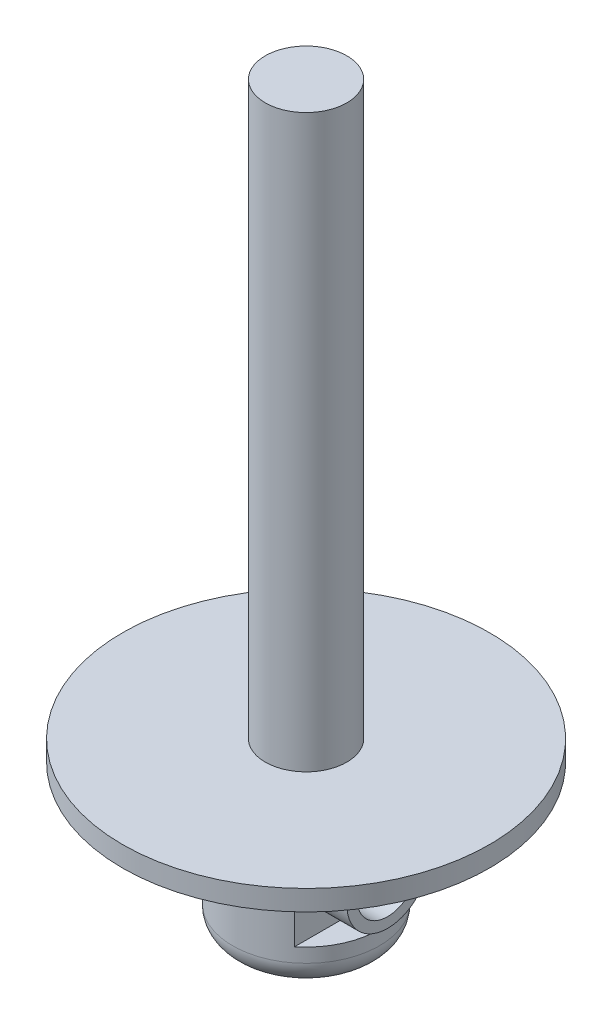
ISO-10303-21;
HEADER;
FILE_DESCRIPTION(('STEP AP214'),'2;1');
FILE_NAME('part.step','',(''),(''),'','','');
FILE_SCHEMA(('AUTOMOTIVE_DESIGN { 1 0 10303 214 1 1 1 1 }'));
ENDSEC;
DATA;
#1=APPLICATION_CONTEXT('core data for automotive mechanical design processes');
#2=APPLICATION_PROTOCOL_DEFINITION('international standard','automotive_design',2000,#1);
#3=PRODUCT_CONTEXT('',#1,'mechanical');
#4=PRODUCT('Part','Part','',(#3));
#5=PRODUCT_RELATED_PRODUCT_CATEGORY('part','',(#4));
#6=PRODUCT_DEFINITION_FORMATION('','',#4);
#7=PRODUCT_DEFINITION_CONTEXT('part definition',#1,'design');
#8=PRODUCT_DEFINITION('design','',#6,#7);
#9=PRODUCT_DEFINITION_SHAPE('','',#8);
#10=(LENGTH_UNIT() NAMED_UNIT(*) SI_UNIT(.MILLI.,.METRE.));
#11=(NAMED_UNIT(*) PLANE_ANGLE_UNIT() SI_UNIT($,.RADIAN.));
#12=(NAMED_UNIT(*) SI_UNIT($,.STERADIAN.) SOLID_ANGLE_UNIT());
#13=UNCERTAINTY_MEASURE_WITH_UNIT(LENGTH_MEASURE(1.E-05),#10,'distance_accuracy_value','');
#14=(GEOMETRIC_REPRESENTATION_CONTEXT(3) GLOBAL_UNCERTAINTY_ASSIGNED_CONTEXT((#13)) GLOBAL_UNIT_ASSIGNED_CONTEXT((#10,
#11,#12)) REPRESENTATION_CONTEXT('',''));
#15=CARTESIAN_POINT('',(0.,0.,0.));
#16=DIRECTION('',(0.,0.,1.));
#17=DIRECTION('',(1.,0.,0.));
#18=AXIS2_PLACEMENT_3D('',#15,#16,#17);
#19=CARTESIAN_POINT('',(11.25,-4.04640826936139,-45.));
#20=DIRECTION('',(-1.,0.,0.));
#21=DIRECTION('',(0.,-1.,0.));
#22=AXIS2_PLACEMENT_3D('',#19,#20,#21);
#23=PLANE('',#22);
#24=DIRECTION('',(0.,0.,1.));
#25=VECTOR('',#24,1.);
#26=CARTESIAN_POINT('',(11.25,-26.5464082693614,-45.));
#27=LINE('',#26,#25);
#28=CARTESIAN_POINT('',(11.25,-26.5464082693614,-14.0512454963964));
#29=VERTEX_POINT('',#28);
#30=CARTESIAN_POINT('',(11.25,-26.5464082693614,14.0512454963964));
#31=VERTEX_POINT('',#30);
#32=EDGE_CURVE('E101',#29,#31,#27,.T.);
#33=ORIENTED_EDGE('',*,*,#32,.F.);
#34=DIRECTION('',(0.,1.,0.));
#35=VECTOR('',#34,1.);
#36=CARTESIAN_POINT('',(11.25,-36.,-14.0512454963964));
#37=LINE('',#36,#35);
#38=CARTESIAN_POINT('',(11.25,-4.0464082693614,-14.0512454963964));
#39=VERTEX_POINT('',#38);
#40=EDGE_CURVE('E92',#39,#29,#37,.F.);
#41=ORIENTED_EDGE('',*,*,#40,.F.);
#42=DIRECTION('',(0.,0.,1.));
#43=VECTOR('',#42,1.);
#44=CARTESIAN_POINT('',(11.25,-4.04640826936139,-45.));
#45=LINE('',#44,#43);
#46=CARTESIAN_POINT('',(11.25,-4.0464082693614,14.0512454963964));
#47=VERTEX_POINT('',#46);
#48=EDGE_CURVE('E68',#39,#47,#45,.T.);
#49=ORIENTED_EDGE('',*,*,#48,.T.);
#50=DIRECTION('',(0.,1.,0.));
#51=VECTOR('',#50,1.);
#52=CARTESIAN_POINT('',(11.25,-36.,14.0512454963964));
#53=LINE('',#52,#51);
#54=EDGE_CURVE('E98',#31,#47,#53,.T.);
#55=ORIENTED_EDGE('',*,*,#54,.F.);
#56=EDGE_LOOP('',(#33,#41,#49,#55));
#57=FACE_BOUND('',#56,.T.);
#58=CARTESIAN_POINT('',(11.25,-15.2964082693614,0.));
#59=DIRECTION('',(-1.,0.,0.));
#60=DIRECTION('',(0.,-1.,0.));
#61=AXIS2_PLACEMENT_3D('',#58,#59,#60);
#62=CIRCLE('',#61,10.);
#63=CARTESIAN_POINT('',(11.25,-25.2964082693614,0.));
#64=VERTEX_POINT('',#63);
#65=EDGE_CURVE('E11',#64,#64,#62,.F.);
#66=ORIENTED_EDGE('',*,*,#65,.F.);
#67=EDGE_LOOP('',(#66));
#68=FACE_BOUND('',#67,.T.);
#69=ADVANCED_FACE('F45',(#57,#68),#23,.F.);
#70=CARTESIAN_POINT('',(-11.25,-4.0464082693614,-45.));
#71=DIRECTION('',(1.,0.,0.));
#72=DIRECTION('',(0.,1.,0.));
#73=AXIS2_PLACEMENT_3D('',#70,#71,#72);
#74=PLANE('',#73);
#75=DIRECTION('',(0.,0.,1.));
#76=VECTOR('',#75,1.);
#77=CARTESIAN_POINT('',(-11.25,-26.5464082693614,-45.));
#78=LINE('',#77,#76);
#79=CARTESIAN_POINT('',(-11.25,-26.5464082693614,-14.0512454963964));
#80=VERTEX_POINT('',#79);
#81=CARTESIAN_POINT('',(-11.25,-26.5464082693614,14.0512454963964));
#82=VERTEX_POINT('',#81);
#83=EDGE_CURVE('E61',#80,#82,#78,.T.);
#84=ORIENTED_EDGE('',*,*,#83,.T.);
#85=DIRECTION('',(0.,1.,0.));
#86=VECTOR('',#85,1.);
#87=CARTESIAN_POINT('',(-11.25,-36.,14.0512454963964));
#88=LINE('',#87,#86);
#89=CARTESIAN_POINT('',(-11.25,-4.0464082693614,14.0512454963964));
#90=VERTEX_POINT('',#89);
#91=EDGE_CURVE('E118',#90,#82,#88,.F.);
#92=ORIENTED_EDGE('',*,*,#91,.F.);
#93=DIRECTION('',(0.,0.,1.));
#94=VECTOR('',#93,1.);
#95=CARTESIAN_POINT('',(-11.25,-4.0464082693614,-45.));
#96=LINE('',#95,#94);
#97=CARTESIAN_POINT('',(-11.25,-4.0464082693614,-14.0512454963964));
#98=VERTEX_POINT('',#97);
#99=EDGE_CURVE('E204',#98,#90,#96,.T.);
#100=ORIENTED_EDGE('',*,*,#99,.F.);
#101=DIRECTION('',(0.,1.,0.));
#102=VECTOR('',#101,1.);
#103=CARTESIAN_POINT('',(-11.25,-36.,-14.0512454963964));
#104=LINE('',#103,#102);
#105=EDGE_CURVE('E122',#80,#98,#104,.T.);
#106=ORIENTED_EDGE('',*,*,#105,.F.);
#107=EDGE_LOOP('',(#84,#92,#100,#106));
#108=FACE_BOUND('',#107,.T.);
#109=CARTESIAN_POINT('',(-11.25,-15.2964082693614,0.));
#110=DIRECTION('',(1.,0.,0.));
#111=DIRECTION('',(0.,1.,0.));
#112=AXIS2_PLACEMENT_3D('',#109,#110,#111);
#113=CIRCLE('',#112,10.);
#114=CARTESIAN_POINT('',(-11.25,-5.29640826936139,0.));
#115=VERTEX_POINT('',#114);
#116=EDGE_CURVE('E49',#115,#115,#113,.F.);
#117=ORIENTED_EDGE('',*,*,#116,.F.);
#118=EDGE_LOOP('',(#117));
#119=FACE_BOUND('',#118,.T.);
#120=ADVANCED_FACE('F135',(#108,#119),#74,.F.);
#121=CARTESIAN_POINT('',(0.,5.,0.));
#122=DIRECTION('',(0.,-1.,0.));
#123=DIRECTION('',(0.,0.,-1.));
#124=AXIS2_PLACEMENT_3D('',#121,#122,#123);
#125=CYLINDRICAL_SURFACE('',#124,45.);
#126=CARTESIAN_POINT('',(0.,5.,0.));
#127=DIRECTION('',(0.,1.,0.));
#128=DIRECTION('',(0.,0.,1.));
#129=AXIS2_PLACEMENT_3D('',#126,#127,#128);
#130=CIRCLE('',#129,45.);
#131=CARTESIAN_POINT('',(0.,5.,45.));
#132=VERTEX_POINT('',#131);
#133=EDGE_CURVE('E195',#132,#132,#130,.T.);
#134=ORIENTED_EDGE('',*,*,#133,.F.);
#135=EDGE_LOOP('',(#134));
#136=FACE_BOUND('',#135,.T.);
#137=CARTESIAN_POINT('',(0.,0.,0.));
#138=DIRECTION('',(0.,1.,0.));
#139=DIRECTION('',(0.,0.,1.));
#140=AXIS2_PLACEMENT_3D('',#137,#138,#139);
#141=CIRCLE('',#140,45.);
#142=CARTESIAN_POINT('',(0.,0.,45.));
#143=VERTEX_POINT('',#142);
#144=EDGE_CURVE('E192',#143,#143,#141,.T.);
#145=ORIENTED_EDGE('',*,*,#144,.T.);
#146=EDGE_LOOP('',(#145));
#147=FACE_BOUND('',#146,.T.);
#148=ADVANCED_FACE('F137',(#136,#147),#125,.T.);
#149=CARTESIAN_POINT('',(0.,5.,0.));
#150=DIRECTION('',(0.,1.,0.));
#151=DIRECTION('',(0.,0.,1.));
#152=AXIS2_PLACEMENT_3D('',#149,#150,#151);
#153=PLANE('',#152);
#154=CARTESIAN_POINT('',(0.,5.,0.));
#155=DIRECTION('',(0.,1.,0.));
#156=DIRECTION('',(0.,0.,1.));
#157=AXIS2_PLACEMENT_3D('',#154,#155,#156);
#158=CIRCLE('',#157,10.);
#159=CARTESIAN_POINT('',(0.,5.,10.));
#160=VERTEX_POINT('',#159);
#161=EDGE_CURVE('E201',#160,#160,#158,.T.);
#162=ORIENTED_EDGE('',*,*,#161,.F.);
#163=EDGE_LOOP('',(#162));
#164=FACE_BOUND('',#163,.T.);
#165=ORIENTED_EDGE('',*,*,#133,.T.);
#166=EDGE_LOOP('',(#165));
#167=FACE_BOUND('',#166,.T.);
#168=ADVANCED_FACE('F144',(#164,#167),#153,.T.);
#169=CARTESIAN_POINT('',(0.,0.,0.));
#170=DIRECTION('',(0.,1.,0.));
#171=DIRECTION('',(0.,0.,1.));
#172=AXIS2_PLACEMENT_3D('',#169,#170,#171);
#173=PLANE('',#172);
#174=CARTESIAN_POINT('',(0.,0.,0.));
#175=DIRECTION('',(0.,-1.,0.));
#176=DIRECTION('',(0.,0.,-1.));
#177=AXIS2_PLACEMENT_3D('',#174,#175,#176);
#178=CIRCLE('',#177,18.);
#179=CARTESIAN_POINT('',(0.,0.,-18.));
#180=VERTEX_POINT('',#179);
#181=EDGE_CURVE('E189',#180,#180,#178,.T.);
#182=ORIENTED_EDGE('',*,*,#181,.F.);
#183=EDGE_LOOP('',(#182));
#184=FACE_BOUND('',#183,.T.);
#185=ORIENTED_EDGE('',*,*,#144,.F.);
#186=EDGE_LOOP('',(#185));
#187=FACE_BOUND('',#186,.T.);
#188=ADVANCED_FACE('F177',(#184,#187),#173,.F.);
#189=CARTESIAN_POINT('',(0.,145.,0.));
#190=DIRECTION('',(0.,-1.,0.));
#191=DIRECTION('',(0.,0.,-1.));
#192=AXIS2_PLACEMENT_3D('',#189,#190,#191);
#193=CYLINDRICAL_SURFACE('',#192,10.);
#194=CARTESIAN_POINT('',(0.,145.,0.));
#195=DIRECTION('',(0.,1.,0.));
#196=DIRECTION('',(0.,0.,1.));
#197=AXIS2_PLACEMENT_3D('',#194,#195,#196);
#198=CIRCLE('',#197,10.);
#199=CARTESIAN_POINT('',(0.,145.,10.));
#200=VERTEX_POINT('',#199);
#201=EDGE_CURVE('E196',#200,#200,#198,.T.);
#202=ORIENTED_EDGE('',*,*,#201,.F.);
#203=EDGE_LOOP('',(#202));
#204=FACE_BOUND('',#203,.T.);
#205=ORIENTED_EDGE('',*,*,#161,.T.);
#206=EDGE_LOOP('',(#205));
#207=FACE_BOUND('',#206,.T.);
#208=ADVANCED_FACE('F173',(#204,#207),#193,.T.);
#209=CARTESIAN_POINT('',(0.,145.,0.));
#210=DIRECTION('',(0.,1.,0.));
#211=DIRECTION('',(0.,0.,1.));
#212=AXIS2_PLACEMENT_3D('',#209,#210,#211);
#213=PLANE('',#212);
#214=ORIENTED_EDGE('',*,*,#201,.T.);
#215=EDGE_LOOP('',(#214));
#216=FACE_BOUND('',#215,.T.);
#217=ADVANCED_FACE('F170',(#216),#213,.T.);
#218=CARTESIAN_POINT('',(0.,-36.,0.));
#219=DIRECTION('',(0.,1.,0.));
#220=DIRECTION('',(0.,0.,1.));
#221=AXIS2_PLACEMENT_3D('',#218,#219,#220);
#222=CYLINDRICAL_SURFACE('',#221,18.);
#223=ORIENTED_EDGE('',*,*,#105,.T.);
#224=CARTESIAN_POINT('',(0.,-4.0464082693614,0.));
#225=DIRECTION('',(0.,1.,0.));
#226=DIRECTION('',(-1.,0.,0.));
#227=AXIS2_PLACEMENT_3D('',#224,#225,#226);
#228=CIRCLE('',#227,18.);
#229=EDGE_CURVE('E125',#98,#90,#228,.T.);
#230=ORIENTED_EDGE('',*,*,#229,.T.);
#231=ORIENTED_EDGE('',*,*,#91,.T.);
#232=CARTESIAN_POINT('',(0.,-26.5464082693614,0.));
#233=DIRECTION('',(0.,-1.,0.));
#234=DIRECTION('',(1.,0.,0.));
#235=AXIS2_PLACEMENT_3D('',#232,#233,#234);
#236=CIRCLE('',#235,18.);
#237=EDGE_CURVE('E111',#82,#80,#236,.T.);
#238=ORIENTED_EDGE('',*,*,#237,.T.);
#239=EDGE_LOOP('',(#223,#230,#231,#238));
#240=FACE_BOUND('',#239,.T.);
#241=ORIENTED_EDGE('',*,*,#40,.T.);
#242=CARTESIAN_POINT('',(0.,-26.5464082693614,0.));
#243=DIRECTION('',(0.,-1.,0.));
#244=DIRECTION('',(0.,0.,-1.));
#245=AXIS2_PLACEMENT_3D('',#242,#243,#244);
#246=CIRCLE('',#245,18.);
#247=EDGE_CURVE('E106',#29,#31,#246,.T.);
#248=ORIENTED_EDGE('',*,*,#247,.T.);
#249=ORIENTED_EDGE('',*,*,#54,.T.);
#250=CARTESIAN_POINT('',(0.,-4.0464082693614,0.));
#251=DIRECTION('',(0.,1.,0.));
#252=DIRECTION('',(-1.,0.,0.));
#253=AXIS2_PLACEMENT_3D('',#250,#251,#252);
#254=CIRCLE('',#253,18.);
#255=EDGE_CURVE('E86',#47,#39,#254,.T.);
#256=ORIENTED_EDGE('',*,*,#255,.T.);
#257=EDGE_LOOP('',(#241,#248,#249,#256));
#258=FACE_BOUND('',#257,.T.);
#259=CARTESIAN_POINT('',(0.,-30.,0.));
#260=DIRECTION('',(0.,-1.,0.));
#261=DIRECTION('',(0.,0.,-1.));
#262=AXIS2_PLACEMENT_3D('',#259,#260,#261);
#263=CIRCLE('',#262,18.);
#264=CARTESIAN_POINT('',(0.,-30.,-18.));
#265=VERTEX_POINT('',#264);
#266=EDGE_CURVE('E93',#265,#265,#263,.F.);
#267=ORIENTED_EDGE('',*,*,#266,.T.);
#268=EDGE_LOOP('',(#267));
#269=FACE_BOUND('',#268,.T.);
#270=ORIENTED_EDGE('',*,*,#181,.T.);
#271=EDGE_LOOP('',(#270));
#272=FACE_BOUND('',#271,.T.);
#273=ADVANCED_FACE('F104',(#240,#258,#269,#272),#222,.T.);
#274=CARTESIAN_POINT('',(0.,-36.,0.));
#275=DIRECTION('',(0.,-1.,0.));
#276=DIRECTION('',(0.,0.,-1.));
#277=AXIS2_PLACEMENT_3D('',#274,#275,#276);
#278=PLANE('',#277);
#279=CARTESIAN_POINT('',(0.,-36.,0.));
#280=DIRECTION('',(0.,-1.,0.));
#281=DIRECTION('',(0.,0.,-1.));
#282=AXIS2_PLACEMENT_3D('',#279,#280,#281);
#283=CIRCLE('',#282,12.);
#284=CARTESIAN_POINT('',(0.,-36.,-12.));
#285=VERTEX_POINT('',#284);
#286=EDGE_CURVE('E208',#285,#285,#283,.T.);
#287=ORIENTED_EDGE('',*,*,#286,.T.);
#288=EDGE_LOOP('',(#287));
#289=FACE_BOUND('',#288,.T.);
#290=ADVANCED_FACE('F164',(#289),#278,.T.);
#291=CARTESIAN_POINT('',(0.,-30.,0.));
#292=DIRECTION('',(0.,-1.,0.));
#293=DIRECTION('',(0.,0.,-1.));
#294=AXIS2_PLACEMENT_3D('',#291,#292,#293);
#295=TOROIDAL_SURFACE('',#294,12.,6.);
#296=ORIENTED_EDGE('',*,*,#266,.F.);
#297=EDGE_LOOP('',(#296));
#298=FACE_BOUND('',#297,.T.);
#299=ORIENTED_EDGE('',*,*,#286,.F.);
#300=EDGE_LOOP('',(#299));
#301=FACE_BOUND('',#300,.T.);
#302=ADVANCED_FACE('F47',(#298,#301),#295,.T.);
#303=CARTESIAN_POINT('',(11.25,-26.5464082693614,-45.));
#304=DIRECTION('',(0.,-1.,0.));
#305=DIRECTION('',(0.,0.,-1.));
#306=AXIS2_PLACEMENT_3D('',#303,#304,#305);
#307=PLANE('',#306);
#308=ORIENTED_EDGE('',*,*,#32,.T.);
#309=ORIENTED_EDGE('',*,*,#247,.F.);
#310=EDGE_LOOP('',(#308,#309));
#311=FACE_BOUND('',#310,.T.);
#312=ADVANCED_FACE('F159',(#311),#307,.F.);
#313=CARTESIAN_POINT('',(32.8988143773995,-4.04640826936139,-45.));
#314=DIRECTION('',(0.,1.,0.));
#315=DIRECTION('',(-1.,0.,0.));
#316=AXIS2_PLACEMENT_3D('',#313,#314,#315);
#317=PLANE('',#316);
#318=ORIENTED_EDGE('',*,*,#48,.F.);
#319=ORIENTED_EDGE('',*,*,#255,.F.);
#320=EDGE_LOOP('',(#318,#319));
#321=FACE_BOUND('',#320,.T.);
#322=ADVANCED_FACE('F87',(#321),#317,.F.);
#323=CARTESIAN_POINT('',(-32.8988143773995,-4.0464082693614,-45.));
#324=DIRECTION('',(0.,1.,0.));
#325=DIRECTION('',(-1.,0.,0.));
#326=AXIS2_PLACEMENT_3D('',#323,#324,#325);
#327=PLANE('',#326);
#328=ORIENTED_EDGE('',*,*,#99,.T.);
#329=ORIENTED_EDGE('',*,*,#229,.F.);
#330=EDGE_LOOP('',(#328,#329));
#331=FACE_BOUND('',#330,.T.);
#332=ADVANCED_FACE('F154',(#331),#327,.F.);
#333=CARTESIAN_POINT('',(-11.25,-26.5464082693614,-45.));
#334=DIRECTION('',(0.,-1.,0.));
#335=DIRECTION('',(1.,0.,0.));
#336=AXIS2_PLACEMENT_3D('',#333,#334,#335);
#337=PLANE('',#336);
#338=ORIENTED_EDGE('',*,*,#83,.F.);
#339=ORIENTED_EDGE('',*,*,#237,.F.);
#340=EDGE_LOOP('',(#338,#339));
#341=FACE_BOUND('',#340,.T.);
#342=ADVANCED_FACE('F151',(#341),#337,.F.);
#343=CARTESIAN_POINT('',(20.,-15.2964082693614,0.));
#344=DIRECTION('',(-1.,0.,0.));
#345=DIRECTION('',(0.,0.,1.));
#346=AXIS2_PLACEMENT_3D('',#343,#344,#345);
#347=CYLINDRICAL_SURFACE('',#346,10.);
#348=CARTESIAN_POINT('',(-20.,-15.2964082693614,0.));
#349=DIRECTION('',(1.,0.,0.));
#350=DIRECTION('',(0.,0.,-1.));
#351=AXIS2_PLACEMENT_3D('',#348,#349,#350);
#352=CIRCLE('',#351,10.);
#353=CARTESIAN_POINT('',(-20.,-15.2964082693614,-10.));
#354=VERTEX_POINT('',#353);
#355=EDGE_CURVE('E414',#354,#354,#352,.T.);
#356=ORIENTED_EDGE('',*,*,#355,.T.);
#357=EDGE_LOOP('',(#356));
#358=FACE_BOUND('',#357,.T.);
#359=ORIENTED_EDGE('',*,*,#116,.T.);
#360=EDGE_LOOP('',(#359));
#361=FACE_BOUND('',#360,.T.);
#362=ADVANCED_FACE('F133',(#358,#361),#347,.T.);
#363=CARTESIAN_POINT('',(-20.,-15.2964082693614,0.));
#364=DIRECTION('',(1.,0.,0.));
#365=DIRECTION('',(0.,0.,-1.));
#366=AXIS2_PLACEMENT_3D('',#363,#364,#365);
#367=PLANE('',#366);
#368=ORIENTED_EDGE('',*,*,#355,.F.);
#369=EDGE_LOOP('',(#368));
#370=FACE_BOUND('',#369,.T.);
#371=CARTESIAN_POINT('',(-20.,-15.2964082693614,0.));
#372=DIRECTION('',(1.,0.,0.));
#373=DIRECTION('',(0.,0.,-1.));
#374=AXIS2_PLACEMENT_3D('',#371,#372,#373);
#375=CIRCLE('',#374,7.5);
#376=CARTESIAN_POINT('',(-20.,-7.7964082693614,0.));
#377=VERTEX_POINT('',#376);
#378=EDGE_CURVE('E415',#377,#377,#375,.T.);
#379=ORIENTED_EDGE('',*,*,#378,.T.);
#380=EDGE_LOOP('',(#379));
#381=FACE_BOUND('',#380,.T.);
#382=ADVANCED_FACE('F248',(#370,#381),#367,.F.);
#383=CARTESIAN_POINT('',(-45.,-15.2964082693614,0.));
#384=DIRECTION('',(1.,0.,0.));
#385=DIRECTION('',(0.,1.,0.));
#386=AXIS2_PLACEMENT_3D('',#383,#384,#385);
#387=CYLINDRICAL_SURFACE('',#386,7.5);
#388=CARTESIAN_POINT('',(20.,-15.2964082693614,0.));
#389=DIRECTION('',(1.,0.,0.));
#390=DIRECTION('',(0.,0.,-1.));
#391=AXIS2_PLACEMENT_3D('',#388,#389,#390);
#392=CIRCLE('',#391,7.5);
#393=CARTESIAN_POINT('',(20.,-7.79640826936139,0.));
#394=VERTEX_POINT('',#393);
#395=EDGE_CURVE('E411',#394,#394,#392,.T.);
#396=CARTESIAN_POINT('',(-20.,-7.7964082693614,0.));
#397=CARTESIAN_POINT('',(-19.5833333333333,-7.7964082693614,0.));
#398=CARTESIAN_POINT('',(-19.1666666666667,-7.7964082693614,0.));
#399=CARTESIAN_POINT('',(-18.3333333333333,-7.7964082693614,0.));
#400=CARTESIAN_POINT('',(-17.9166666666667,-7.7964082693614,0.));
#401=CARTESIAN_POINT('',(-17.0833333333333,-7.7964082693614,0.));
#402=CARTESIAN_POINT('',(-16.6666666666667,-7.7964082693614,0.));
#403=CARTESIAN_POINT('',(-15.8333333333333,-7.7964082693614,0.));
#404=CARTESIAN_POINT('',(-15.4166666666667,-7.7964082693614,0.));
#405=CARTESIAN_POINT('',(-14.5833333333333,-7.7964082693614,0.));
#406=CARTESIAN_POINT('',(-14.1666666666667,-7.7964082693614,0.));
#407=CARTESIAN_POINT('',(-13.3333333333333,-7.7964082693614,0.));
#408=CARTESIAN_POINT('',(-12.9166666666667,-7.7964082693614,0.));
#409=CARTESIAN_POINT('',(-12.0833333333333,-7.7964082693614,0.));
#410=CARTESIAN_POINT('',(-11.6666666666667,-7.7964082693614,0.));
#411=CARTESIAN_POINT('',(-10.8333333333333,-7.7964082693614,0.));
#412=CARTESIAN_POINT('',(-10.4166666666667,-7.7964082693614,0.));
#413=CARTESIAN_POINT('',(-9.58333333333333,-7.7964082693614,0.));
#414=CARTESIAN_POINT('',(-9.16666666666667,-7.7964082693614,0.));
#415=CARTESIAN_POINT('',(-8.33333333333333,-7.7964082693614,0.));
#416=CARTESIAN_POINT('',(-7.91666666666667,-7.7964082693614,0.));
#417=CARTESIAN_POINT('',(-7.08333333333333,-7.7964082693614,0.));
#418=CARTESIAN_POINT('',(-6.66666666666667,-7.7964082693614,0.));
#419=CARTESIAN_POINT('',(-5.83333333333333,-7.7964082693614,0.));
#420=CARTESIAN_POINT('',(-5.41666666666666,-7.7964082693614,0.));
#421=CARTESIAN_POINT('',(-4.58333333333333,-7.7964082693614,0.));
#422=CARTESIAN_POINT('',(-4.16666666666666,-7.7964082693614,0.));
#423=CARTESIAN_POINT('',(-3.33333333333333,-7.7964082693614,0.));
#424=CARTESIAN_POINT('',(-2.91666666666666,-7.7964082693614,0.));
#425=CARTESIAN_POINT('',(-2.08333333333333,-7.7964082693614,0.));
#426=CARTESIAN_POINT('',(-1.66666666666666,-7.7964082693614,0.));
#427=CARTESIAN_POINT('',(-0.833333333333327,-7.7964082693614,0.));
#428=CARTESIAN_POINT('',(-0.41666666666666,-7.7964082693614,0.));
#429=CARTESIAN_POINT('',(0.416666666666674,-7.7964082693614,0.));
#430=CARTESIAN_POINT('',(0.833333333333341,-7.7964082693614,0.));
#431=CARTESIAN_POINT('',(1.66666666666667,-7.7964082693614,0.));
#432=CARTESIAN_POINT('',(2.08333333333334,-7.7964082693614,0.));
#433=CARTESIAN_POINT('',(2.91666666666667,-7.7964082693614,0.));
#434=CARTESIAN_POINT('',(3.33333333333334,-7.79640826936139,0.));
#435=CARTESIAN_POINT('',(4.16666666666667,-7.79640826936139,0.));
#436=CARTESIAN_POINT('',(4.58333333333334,-7.79640826936139,0.));
#437=CARTESIAN_POINT('',(5.41666666666667,-7.79640826936139,0.));
#438=CARTESIAN_POINT('',(5.83333333333334,-7.79640826936139,0.));
#439=CARTESIAN_POINT('',(6.66666666666667,-7.79640826936139,0.));
#440=CARTESIAN_POINT('',(7.08333333333334,-7.79640826936139,0.));
#441=CARTESIAN_POINT('',(7.91666666666667,-7.79640826936139,0.));
#442=CARTESIAN_POINT('',(8.33333333333334,-7.79640826936139,0.));
#443=CARTESIAN_POINT('',(9.16666666666667,-7.79640826936139,0.));
#444=CARTESIAN_POINT('',(9.58333333333334,-7.79640826936139,0.));
#445=CARTESIAN_POINT('',(10.4166666666667,-7.79640826936139,0.));
#446=CARTESIAN_POINT('',(10.8333333333333,-7.79640826936139,0.));
#447=CARTESIAN_POINT('',(11.6666666666667,-7.79640826936139,0.));
#448=CARTESIAN_POINT('',(12.0833333333333,-7.79640826936139,0.));
#449=CARTESIAN_POINT('',(12.9166666666667,-7.79640826936139,0.));
#450=CARTESIAN_POINT('',(13.3333333333333,-7.79640826936139,0.));
#451=CARTESIAN_POINT('',(14.1666666666667,-7.79640826936139,0.));
#452=CARTESIAN_POINT('',(14.5833333333333,-7.79640826936139,0.));
#453=CARTESIAN_POINT('',(15.4166666666667,-7.79640826936139,0.));
#454=CARTESIAN_POINT('',(15.8333333333333,-7.79640826936139,0.));
#455=CARTESIAN_POINT('',(16.6666666666667,-7.79640826936139,0.));
#456=CARTESIAN_POINT('',(17.0833333333333,-7.79640826936139,0.));
#457=CARTESIAN_POINT('',(17.9166666666667,-7.79640826936139,0.));
#458=CARTESIAN_POINT('',(18.3333333333333,-7.79640826936139,0.));
#459=CARTESIAN_POINT('',(19.1666666666667,-7.79640826936139,0.));
#460=CARTESIAN_POINT('',(19.5833333333333,-7.79640826936139,0.));
#461=CARTESIAN_POINT('',(20.,-7.79640826936139,0.));
#462=B_SPLINE_CURVE_WITH_KNOTS('',3,(#396,#397,#398,#399,#400,#401,#402,#403,#404,#405,#406,
#407,#408,#409,#410,#411,#412,#413,#414,#415,#416,#417,#418,#419,#420,#421,#422,#423,#424,#425,
#426,#427,#428,#429,#430,#431,#432,#433,#434,#435,#436,#437,#438,#439,#440,#441,#442,#443,#444,
#445,#446,#447,#448,#449,#450,#451,#452,#453,#454,#455,#456,#457,#458,#459,#460,#461),
.UNSPECIFIED.,.F.,.F.,(4,2,2,2,2,2,2,2,2,2,2,2,2,2,2,2,2,2,2,2,2,2,2,2,2,2,2,2,2,2,2,2,4),(0.,
1.25,2.5,3.75,5.,6.25,7.5,8.75,10.,11.25,12.5,13.75,15.,16.25,17.5,18.75,20.,21.25,22.5,23.75,
25.,26.25,27.5,28.75,30.,31.25,32.5,33.75,35.,36.25,37.5,38.75,40.),.UNSPECIFIED.);
#463=EDGE_CURVE('BSEAM149',#377,#394,#462,.T.);
#464=ORIENTED_EDGE('',*,*,#378,.F.);
#465=ORIENTED_EDGE('',*,*,#395,.T.);
#466=ORIENTED_EDGE('',*,*,#463,.T.);
#467=ORIENTED_EDGE('',*,*,#463,.F.);
#468=EDGE_LOOP('',(#464,#466,#465,#467));
#469=FACE_BOUND('',#468,.T.);
#470=ADVANCED_FACE('F149',(#469),#387,.F.);
#471=CARTESIAN_POINT('',(20.,-15.2964082693614,0.));
#472=DIRECTION('',(1.,0.,0.));
#473=DIRECTION('',(0.,0.,-1.));
#474=AXIS2_PLACEMENT_3D('',#471,#472,#473);
#475=CIRCLE('',#474,10.);
#476=CARTESIAN_POINT('',(20.,-15.2964082693614,-10.));
#477=VERTEX_POINT('',#476);
#478=EDGE_CURVE('E408',#477,#477,#475,.T.);
#479=ORIENTED_EDGE('',*,*,#478,.F.);
#480=EDGE_LOOP('',(#479));
#481=FACE_BOUND('',#480,.T.);
#482=ORIENTED_EDGE('',*,*,#65,.T.);
#483=EDGE_LOOP('',(#482));
#484=FACE_BOUND('',#483,.T.);
#485=ADVANCED_FACE('F250',(#481,#484),#347,.T.);
#486=CARTESIAN_POINT('',(20.,-15.2964082693614,0.));
#487=DIRECTION('',(1.,0.,0.));
#488=DIRECTION('',(0.,0.,-1.));
#489=AXIS2_PLACEMENT_3D('',#486,#487,#488);
#490=PLANE('',#489);
#491=ORIENTED_EDGE('',*,*,#478,.T.);
#492=EDGE_LOOP('',(#491));
#493=FACE_BOUND('',#492,.T.);
#494=ORIENTED_EDGE('',*,*,#395,.F.);
#495=EDGE_LOOP('',(#494));
#496=FACE_BOUND('',#495,.T.);
#497=ADVANCED_FACE('F269',(#493,#496),#490,.T.);
#498=CLOSED_SHELL('',(#69,#120,#148,#168,#188,#208,#217,#273,#290,#302,#312,#322,#332,#342,#362,
#382,#470,#485,#497));
#499=MANIFOLD_SOLID_BREP('B2',#498);
#500=ADVANCED_BREP_SHAPE_REPRESENTATION('',(#18,#499),#14);
#501=SHAPE_DEFINITION_REPRESENTATION(#9,#500);
ENDSEC;
END-ISO-10303-21;
